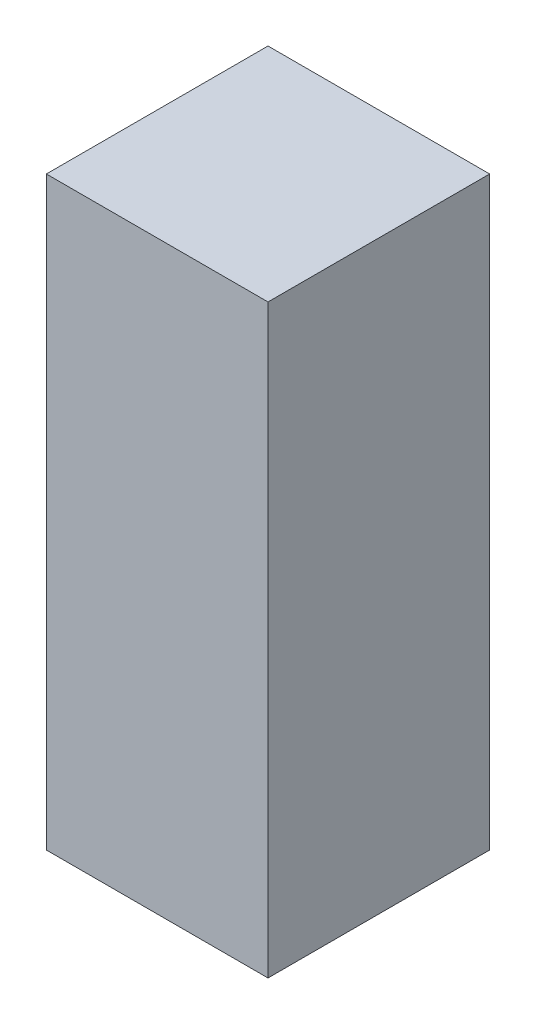
ISO-10303-21;
HEADER;
FILE_DESCRIPTION(('STEP AP214'),'2;1');
FILE_NAME('part.step','',(''),(''),'','','');
FILE_SCHEMA(('AUTOMOTIVE_DESIGN { 1 0 10303 214 1 1 1 1 }'));
ENDSEC;
DATA;
#1=APPLICATION_CONTEXT('core data for automotive mechanical design processes');
#2=APPLICATION_PROTOCOL_DEFINITION('international standard','automotive_design',2000,#1);
#3=PRODUCT_CONTEXT('',#1,'mechanical');
#4=PRODUCT('Part','Part','',(#3));
#5=PRODUCT_RELATED_PRODUCT_CATEGORY('part','',(#4));
#6=PRODUCT_DEFINITION_FORMATION('','',#4);
#7=PRODUCT_DEFINITION_CONTEXT('part definition',#1,'design');
#8=PRODUCT_DEFINITION('design','',#6,#7);
#9=PRODUCT_DEFINITION_SHAPE('','',#8);
#10=(LENGTH_UNIT() NAMED_UNIT(*) SI_UNIT(.MILLI.,.METRE.));
#11=(NAMED_UNIT(*) PLANE_ANGLE_UNIT() SI_UNIT($,.RADIAN.));
#12=(NAMED_UNIT(*) SI_UNIT($,.STERADIAN.) SOLID_ANGLE_UNIT());
#13=UNCERTAINTY_MEASURE_WITH_UNIT(LENGTH_MEASURE(1.E-05),#10,'distance_accuracy_value','');
#14=(GEOMETRIC_REPRESENTATION_CONTEXT(3) GLOBAL_UNCERTAINTY_ASSIGNED_CONTEXT((#13)) GLOBAL_UNIT_ASSIGNED_CONTEXT((#10,
#11,#12)) REPRESENTATION_CONTEXT('',''));
#15=CARTESIAN_POINT('',(0.,0.,0.));
#16=DIRECTION('',(0.,0.,1.));
#17=DIRECTION('',(1.,0.,0.));
#18=AXIS2_PLACEMENT_3D('',#15,#16,#17);
#19=CARTESIAN_POINT('',(2.65,14.,-2.65));
#20=DIRECTION('',(-1.,0.,0.));
#21=DIRECTION('',(0.,0.,1.));
#22=AXIS2_PLACEMENT_3D('',#19,#20,#21);
#23=PLANE('',#22);
#24=DIRECTION('',(0.,0.,-1.));
#25=VECTOR('',#24,1.);
#26=CARTESIAN_POINT('',(2.65,0.,-2.65));
#27=LINE('',#26,#25);
#28=CARTESIAN_POINT('',(2.65,0.,2.65));
#29=VERTEX_POINT('',#28);
#30=CARTESIAN_POINT('',(2.65,0.,-2.65));
#31=VERTEX_POINT('',#30);
#32=EDGE_CURVE('E103',#29,#31,#27,.T.);
#33=ORIENTED_EDGE('',*,*,#32,.T.);
#34=DIRECTION('',(0.,-1.,0.));
#35=VECTOR('',#34,1.);
#36=CARTESIAN_POINT('',(2.65,14.,-2.65));
#37=LINE('',#36,#35);
#38=CARTESIAN_POINT('',(2.65,14.,-2.65));
#39=VERTEX_POINT('',#38);
#40=EDGE_CURVE('E12',#39,#31,#37,.T.);
#41=ORIENTED_EDGE('',*,*,#40,.F.);
#42=DIRECTION('',(0.,0.,-1.));
#43=VECTOR('',#42,1.);
#44=CARTESIAN_POINT('',(2.65,14.,-2.65));
#45=LINE('',#44,#43);
#46=CARTESIAN_POINT('',(2.65,14.,2.65));
#47=VERTEX_POINT('',#46);
#48=EDGE_CURVE('E88',#47,#39,#45,.T.);
#49=ORIENTED_EDGE('',*,*,#48,.F.);
#50=DIRECTION('',(0.,-1.,0.));
#51=VECTOR('',#50,1.);
#52=CARTESIAN_POINT('',(2.65,14.,2.65));
#53=LINE('',#52,#51);
#54=EDGE_CURVE('E98',#47,#29,#53,.T.);
#55=ORIENTED_EDGE('',*,*,#54,.T.);
#56=EDGE_LOOP('',(#33,#41,#49,#55));
#57=FACE_BOUND('',#56,.T.);
#58=ADVANCED_FACE('F35',(#57),#23,.F.);
#59=CARTESIAN_POINT('',(-2.65,14.,-2.65));
#60=DIRECTION('',(0.,0.,1.));
#61=DIRECTION('',(1.,0.,0.));
#62=AXIS2_PLACEMENT_3D('',#59,#60,#61);
#63=PLANE('',#62);
#64=DIRECTION('',(-1.,0.,0.));
#65=VECTOR('',#64,1.);
#66=CARTESIAN_POINT('',(-2.65,0.,-2.65));
#67=LINE('',#66,#65);
#68=CARTESIAN_POINT('',(-2.65,0.,-2.65));
#69=VERTEX_POINT('',#68);
#70=EDGE_CURVE('E93',#31,#69,#67,.T.);
#71=ORIENTED_EDGE('',*,*,#70,.T.);
#72=DIRECTION('',(0.,-1.,0.));
#73=VECTOR('',#72,1.);
#74=CARTESIAN_POINT('',(-2.65,14.,-2.65));
#75=LINE('',#74,#73);
#76=CARTESIAN_POINT('',(-2.65,14.,-2.65));
#77=VERTEX_POINT('',#76);
#78=EDGE_CURVE('E45',#77,#69,#75,.T.);
#79=ORIENTED_EDGE('',*,*,#78,.F.);
#80=DIRECTION('',(-1.,0.,0.));
#81=VECTOR('',#80,1.);
#82=CARTESIAN_POINT('',(-2.65,14.,-2.65));
#83=LINE('',#82,#81);
#84=EDGE_CURVE('E83',#39,#77,#83,.T.);
#85=ORIENTED_EDGE('',*,*,#84,.F.);
#86=ORIENTED_EDGE('',*,*,#40,.T.);
#87=EDGE_LOOP('',(#71,#79,#85,#86));
#88=FACE_BOUND('',#87,.T.);
#89=ADVANCED_FACE('F92',(#88),#63,.F.);
#90=CARTESIAN_POINT('',(-2.65,14.,-2.65));
#91=DIRECTION('',(1.,0.,0.));
#92=DIRECTION('',(0.,0.,-1.));
#93=AXIS2_PLACEMENT_3D('',#90,#91,#92);
#94=PLANE('',#93);
#95=DIRECTION('',(0.,0.,1.));
#96=VECTOR('',#95,1.);
#97=CARTESIAN_POINT('',(-2.65,0.,-2.65));
#98=LINE('',#97,#96);
#99=CARTESIAN_POINT('',(-2.65,0.,2.65));
#100=VERTEX_POINT('',#99);
#101=EDGE_CURVE('E70',#69,#100,#98,.T.);
#102=ORIENTED_EDGE('',*,*,#101,.T.);
#103=DIRECTION('',(0.,-1.,0.));
#104=VECTOR('',#103,1.);
#105=CARTESIAN_POINT('',(-2.65,14.,2.65));
#106=LINE('',#105,#104);
#107=CARTESIAN_POINT('',(-2.65,14.,2.65));
#108=VERTEX_POINT('',#107);
#109=EDGE_CURVE('E95',#108,#100,#106,.T.);
#110=ORIENTED_EDGE('',*,*,#109,.F.);
#111=DIRECTION('',(0.,0.,1.));
#112=VECTOR('',#111,1.);
#113=CARTESIAN_POINT('',(-2.65,14.,-2.65));
#114=LINE('',#113,#112);
#115=EDGE_CURVE('E86',#77,#108,#114,.T.);
#116=ORIENTED_EDGE('',*,*,#115,.F.);
#117=ORIENTED_EDGE('',*,*,#78,.T.);
#118=EDGE_LOOP('',(#102,#110,#116,#117));
#119=FACE_BOUND('',#118,.T.);
#120=ADVANCED_FACE('F96',(#119),#94,.F.);
#121=CARTESIAN_POINT('',(-2.65,14.,2.65));
#122=DIRECTION('',(0.,0.,-1.));
#123=DIRECTION('',(-1.,0.,0.));
#124=AXIS2_PLACEMENT_3D('',#121,#122,#123);
#125=PLANE('',#124);
#126=DIRECTION('',(1.,0.,0.));
#127=VECTOR('',#126,1.);
#128=CARTESIAN_POINT('',(-2.65,0.,2.65));
#129=LINE('',#128,#127);
#130=EDGE_CURVE('E76',#100,#29,#129,.T.);
#131=ORIENTED_EDGE('',*,*,#130,.T.);
#132=ORIENTED_EDGE('',*,*,#54,.F.);
#133=DIRECTION('',(1.,0.,0.));
#134=VECTOR('',#133,1.);
#135=CARTESIAN_POINT('',(-2.65,14.,2.65));
#136=LINE('',#135,#134);
#137=EDGE_CURVE('E53',#108,#47,#136,.T.);
#138=ORIENTED_EDGE('',*,*,#137,.F.);
#139=ORIENTED_EDGE('',*,*,#109,.T.);
#140=EDGE_LOOP('',(#131,#132,#138,#139));
#141=FACE_BOUND('',#140,.T.);
#142=ADVANCED_FACE('F124',(#141),#125,.F.);
#143=CARTESIAN_POINT('',(0.,14.,0.));
#144=DIRECTION('',(0.,1.,0.));
#145=DIRECTION('',(0.,0.,1.));
#146=AXIS2_PLACEMENT_3D('',#143,#144,#145);
#147=PLANE('',#146);
#148=ORIENTED_EDGE('',*,*,#48,.T.);
#149=ORIENTED_EDGE('',*,*,#84,.T.);
#150=ORIENTED_EDGE('',*,*,#115,.T.);
#151=ORIENTED_EDGE('',*,*,#137,.T.);
#152=EDGE_LOOP('',(#148,#149,#150,#151));
#153=FACE_BOUND('',#152,.T.);
#154=ADVANCED_FACE('F84',(#153),#147,.T.);
#155=CARTESIAN_POINT('',(0.,0.,0.));
#156=DIRECTION('',(0.,1.,0.));
#157=DIRECTION('',(0.,0.,1.));
#158=AXIS2_PLACEMENT_3D('',#155,#156,#157);
#159=PLANE('',#158);
#160=ORIENTED_EDGE('',*,*,#32,.F.);
#161=ORIENTED_EDGE('',*,*,#130,.F.);
#162=ORIENTED_EDGE('',*,*,#101,.F.);
#163=ORIENTED_EDGE('',*,*,#70,.F.);
#164=EDGE_LOOP('',(#160,#161,#162,#163));
#165=FACE_BOUND('',#164,.T.);
#166=ADVANCED_FACE('F118',(#165),#159,.F.);
#167=CLOSED_SHELL('',(#58,#89,#120,#142,#154,#166));
#168=MANIFOLD_SOLID_BREP('B2',#167);
#169=ADVANCED_BREP_SHAPE_REPRESENTATION('',(#18,#168),#14);
#170=SHAPE_DEFINITION_REPRESENTATION(#9,#169);
ENDSEC;
END-ISO-10303-21;
